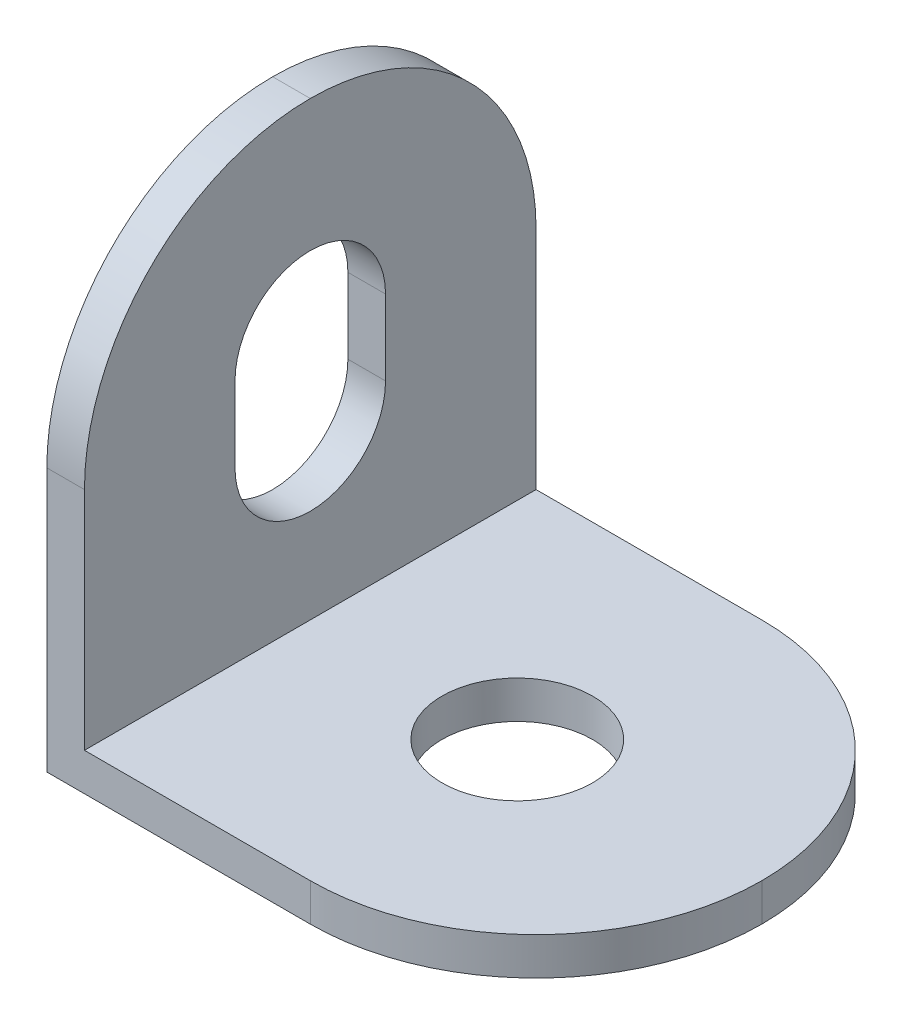
ISO-10303-21;
HEADER;
FILE_DESCRIPTION(('STEP AP214'),'2;1');
FILE_NAME('part.step','',(''),(''),'','','');
FILE_SCHEMA(('AUTOMOTIVE_DESIGN { 1 0 10303 214 1 1 1 1 }'));
ENDSEC;
DATA;
#1=APPLICATION_CONTEXT('core data for automotive mechanical design processes');
#2=APPLICATION_PROTOCOL_DEFINITION('international standard','automotive_design',2000,#1);
#3=PRODUCT_CONTEXT('',#1,'mechanical');
#4=PRODUCT('Part','Part','',(#3));
#5=PRODUCT_RELATED_PRODUCT_CATEGORY('part','',(#4));
#6=PRODUCT_DEFINITION_FORMATION('','',#4);
#7=PRODUCT_DEFINITION_CONTEXT('part definition',#1,'design');
#8=PRODUCT_DEFINITION('design','',#6,#7);
#9=PRODUCT_DEFINITION_SHAPE('','',#8);
#10=(LENGTH_UNIT() NAMED_UNIT(*) SI_UNIT(.MILLI.,.METRE.));
#11=(NAMED_UNIT(*) PLANE_ANGLE_UNIT() SI_UNIT($,.RADIAN.));
#12=(NAMED_UNIT(*) SI_UNIT($,.STERADIAN.) SOLID_ANGLE_UNIT());
#13=UNCERTAINTY_MEASURE_WITH_UNIT(LENGTH_MEASURE(1.E-05),#10,'distance_accuracy_value','');
#14=(GEOMETRIC_REPRESENTATION_CONTEXT(3) GLOBAL_UNCERTAINTY_ASSIGNED_CONTEXT((#13)) GLOBAL_UNIT_ASSIGNED_CONTEXT((#10,
#11,#12)) REPRESENTATION_CONTEXT('',''));
#15=CARTESIAN_POINT('',(0.,0.,0.));
#16=DIRECTION('',(0.,0.,1.));
#17=DIRECTION('',(1.,0.,0.));
#18=AXIS2_PLACEMENT_3D('',#15,#16,#17);
#19=CARTESIAN_POINT('',(0.,13.,12.));
#20=DIRECTION('',(1.,0.,0.));
#21=DIRECTION('',(0.,1.,0.));
#22=AXIS2_PLACEMENT_3D('',#19,#20,#21);
#23=PLANE('',#22);
#24=DIRECTION('',(0.,1.,0.));
#25=VECTOR('',#24,1.);
#26=CARTESIAN_POINT('',(0.,5.5,8.));
#27=LINE('',#26,#25);
#28=CARTESIAN_POINT('',(0.,5.5,8.));
#29=VERTEX_POINT('',#28);
#30=CARTESIAN_POINT('',(0.,7.5,8.));
#31=VERTEX_POINT('',#30);
#32=EDGE_CURVE('E137',#29,#31,#27,.T.);
#33=ORIENTED_EDGE('',*,*,#32,.F.);
#34=CARTESIAN_POINT('',(0.,5.5,6.));
#35=DIRECTION('',(-1.,0.,0.));
#36=DIRECTION('',(0.,-1.,0.));
#37=AXIS2_PLACEMENT_3D('',#34,#35,#36);
#38=CIRCLE('',#37,2.);
#39=CARTESIAN_POINT('',(0.,5.5,4.));
#40=VERTEX_POINT('',#39);
#41=EDGE_CURVE('E142',#40,#29,#38,.T.);
#42=ORIENTED_EDGE('',*,*,#41,.F.);
#43=DIRECTION('',(0.,-1.,0.));
#44=VECTOR('',#43,1.);
#45=CARTESIAN_POINT('',(0.,5.5,4.));
#46=LINE('',#45,#44);
#47=CARTESIAN_POINT('',(0.,7.5,4.));
#48=VERTEX_POINT('',#47);
#49=EDGE_CURVE('E146',#48,#40,#46,.T.);
#50=ORIENTED_EDGE('',*,*,#49,.F.);
#51=CARTESIAN_POINT('',(0.,7.5,6.));
#52=DIRECTION('',(-1.,0.,0.));
#53=DIRECTION('',(0.,-1.,0.));
#54=AXIS2_PLACEMENT_3D('',#51,#52,#53);
#55=CIRCLE('',#54,2.);
#56=EDGE_CURVE('E126',#31,#48,#55,.T.);
#57=ORIENTED_EDGE('',*,*,#56,.F.);
#58=EDGE_LOOP('',(#33,#42,#50,#57));
#59=FACE_BOUND('',#58,.T.);
#60=CARTESIAN_POINT('',(0.,7.,6.));
#61=DIRECTION('',(1.,0.,0.));
#62=DIRECTION('',(0.,1.,0.));
#63=AXIS2_PLACEMENT_3D('',#60,#61,#62);
#64=CIRCLE('',#63,6.);
#65=CARTESIAN_POINT('',(0.,7.,12.));
#66=VERTEX_POINT('',#65);
#67=CARTESIAN_POINT('',(0.,13.,6.));
#68=VERTEX_POINT('',#67);
#69=EDGE_CURVE('E188',#66,#68,#64,.F.);
#70=ORIENTED_EDGE('',*,*,#69,.T.);
#71=CARTESIAN_POINT('',(0.,7.,6.));
#72=DIRECTION('',(1.,0.,0.));
#73=DIRECTION('',(0.,1.,0.));
#74=AXIS2_PLACEMENT_3D('',#71,#72,#73);
#75=CIRCLE('',#74,6.);
#76=CARTESIAN_POINT('',(0.,7.,0.));
#77=VERTEX_POINT('',#76);
#78=EDGE_CURVE('E194',#68,#77,#75,.F.);
#79=ORIENTED_EDGE('',*,*,#78,.T.);
#80=DIRECTION('',(0.,-1.,0.));
#81=VECTOR('',#80,1.);
#82=CARTESIAN_POINT('',(0.,13.,0.));
#83=LINE('',#82,#81);
#84=CARTESIAN_POINT('',(0.,0.,0.));
#85=VERTEX_POINT('',#84);
#86=EDGE_CURVE('E153',#77,#85,#83,.T.);
#87=ORIENTED_EDGE('',*,*,#86,.T.);
#88=DIRECTION('',(0.,0.,-1.));
#89=VECTOR('',#88,1.);
#90=CARTESIAN_POINT('',(0.,0.,12.));
#91=LINE('',#90,#89);
#92=CARTESIAN_POINT('',(0.,0.,12.));
#93=VERTEX_POINT('',#92);
#94=EDGE_CURVE('E176',#93,#85,#91,.T.);
#95=ORIENTED_EDGE('',*,*,#94,.F.);
#96=DIRECTION('',(0.,-1.,0.));
#97=VECTOR('',#96,1.);
#98=CARTESIAN_POINT('',(0.,13.,12.));
#99=LINE('',#98,#97);
#100=EDGE_CURVE('E156',#66,#93,#99,.T.);
#101=ORIENTED_EDGE('',*,*,#100,.F.);
#102=EDGE_LOOP('',(#70,#79,#87,#95,#101));
#103=FACE_BOUND('',#102,.T.);
#104=ADVANCED_FACE('F32',(#59,#103),#23,.F.);
#105=CARTESIAN_POINT('',(0.,0.,12.));
#106=DIRECTION('',(0.,1.,0.));
#107=DIRECTION('',(0.,0.,1.));
#108=AXIS2_PLACEMENT_3D('',#105,#106,#107);
#109=PLANE('',#108);
#110=CARTESIAN_POINT('',(6.5,0.,6.));
#111=DIRECTION('',(0.,-1.,0.));
#112=DIRECTION('',(0.,0.,-1.));
#113=AXIS2_PLACEMENT_3D('',#110,#111,#112);
#114=CIRCLE('',#113,2.);
#115=CARTESIAN_POINT('',(6.5,0.,4.));
#116=VERTEX_POINT('',#115);
#117=EDGE_CURVE('E192',#116,#116,#114,.T.);
#118=ORIENTED_EDGE('',*,*,#117,.F.);
#119=EDGE_LOOP('',(#118));
#120=FACE_BOUND('',#119,.T.);
#121=DIRECTION('',(1.,0.,0.));
#122=VECTOR('',#121,1.);
#123=CARTESIAN_POINT('',(0.,0.,0.));
#124=LINE('',#123,#122);
#125=CARTESIAN_POINT('',(7.,0.,0.));
#126=VERTEX_POINT('',#125);
#127=EDGE_CURVE('E168',#85,#126,#124,.T.);
#128=ORIENTED_EDGE('',*,*,#127,.T.);
#129=CARTESIAN_POINT('',(7.,0.,6.));
#130=DIRECTION('',(0.,1.,0.));
#131=DIRECTION('',(0.,0.,1.));
#132=AXIS2_PLACEMENT_3D('',#129,#130,#131);
#133=CIRCLE('',#132,6.);
#134=CARTESIAN_POINT('',(13.,0.,6.));
#135=VERTEX_POINT('',#134);
#136=EDGE_CURVE('E54',#126,#135,#133,.F.);
#137=ORIENTED_EDGE('',*,*,#136,.T.);
#138=CARTESIAN_POINT('',(7.,0.,6.));
#139=DIRECTION('',(0.,1.,0.));
#140=DIRECTION('',(0.,0.,1.));
#141=AXIS2_PLACEMENT_3D('',#138,#139,#140);
#142=CIRCLE('',#141,6.);
#143=CARTESIAN_POINT('',(7.,0.,12.));
#144=VERTEX_POINT('',#143);
#145=EDGE_CURVE('E49',#135,#144,#142,.F.);
#146=ORIENTED_EDGE('',*,*,#145,.T.);
#147=DIRECTION('',(1.,0.,0.));
#148=VECTOR('',#147,1.);
#149=CARTESIAN_POINT('',(0.,0.,12.));
#150=LINE('',#149,#148);
#151=EDGE_CURVE('E158',#93,#144,#150,.T.);
#152=ORIENTED_EDGE('',*,*,#151,.F.);
#153=ORIENTED_EDGE('',*,*,#94,.T.);
#154=EDGE_LOOP('',(#128,#137,#146,#152,#153));
#155=FACE_BOUND('',#154,.T.);
#156=ADVANCED_FACE('F247',(#120,#155),#109,.F.);
#157=CARTESIAN_POINT('',(13.,0.999999999999997,12.));
#158=DIRECTION('',(0.,-1.,0.));
#159=DIRECTION('',(1.,0.,0.));
#160=AXIS2_PLACEMENT_3D('',#157,#158,#159);
#161=PLANE('',#160);
#162=CARTESIAN_POINT('',(6.5,0.999999999999997,6.));
#163=DIRECTION('',(0.,-1.,0.));
#164=DIRECTION('',(1.,0.,0.));
#165=AXIS2_PLACEMENT_3D('',#162,#163,#164);
#166=CIRCLE('',#165,2.);
#167=CARTESIAN_POINT('',(8.5,0.999999999999998,6.));
#168=VERTEX_POINT('',#167);
#169=EDGE_CURVE('E189',#168,#168,#166,.T.);
#170=ORIENTED_EDGE('',*,*,#169,.T.);
#171=EDGE_LOOP('',(#170));
#172=FACE_BOUND('',#171,.T.);
#173=CARTESIAN_POINT('',(7.,0.999999999999996,6.));
#174=DIRECTION('',(0.,-1.,0.));
#175=DIRECTION('',(1.,0.,0.));
#176=AXIS2_PLACEMENT_3D('',#173,#174,#175);
#177=CIRCLE('',#176,6.);
#178=CARTESIAN_POINT('',(7.,0.999999999999996,12.));
#179=VERTEX_POINT('',#178);
#180=CARTESIAN_POINT('',(13.,0.999999999999997,6.));
#181=VERTEX_POINT('',#180);
#182=EDGE_CURVE('E206',#179,#181,#177,.F.);
#183=ORIENTED_EDGE('',*,*,#182,.T.);
#184=CARTESIAN_POINT('',(7.,0.999999999999996,6.));
#185=DIRECTION('',(0.,-1.,0.));
#186=DIRECTION('',(1.,0.,0.));
#187=AXIS2_PLACEMENT_3D('',#184,#185,#186);
#188=CIRCLE('',#187,6.);
#189=CARTESIAN_POINT('',(7.,0.999999999999996,0.));
#190=VERTEX_POINT('',#189);
#191=EDGE_CURVE('E208',#181,#190,#188,.F.);
#192=ORIENTED_EDGE('',*,*,#191,.T.);
#193=DIRECTION('',(-1.,0.,0.));
#194=VECTOR('',#193,1.);
#195=CARTESIAN_POINT('',(13.,0.999999999999997,0.));
#196=LINE('',#195,#194);
#197=CARTESIAN_POINT('',(1.00000000000001,0.999999999999996,0.));
#198=VERTEX_POINT('',#197);
#199=EDGE_CURVE('E170',#190,#198,#196,.T.);
#200=ORIENTED_EDGE('',*,*,#199,.T.);
#201=DIRECTION('',(0.,0.,-1.));
#202=VECTOR('',#201,1.);
#203=CARTESIAN_POINT('',(1.00000000000001,0.999999999999996,12.));
#204=LINE('',#203,#202);
#205=CARTESIAN_POINT('',(1.00000000000001,0.999999999999996,12.));
#206=VERTEX_POINT('',#205);
#207=EDGE_CURVE('E166',#206,#198,#204,.T.);
#208=ORIENTED_EDGE('',*,*,#207,.F.);
#209=DIRECTION('',(-1.,0.,0.));
#210=VECTOR('',#209,1.);
#211=CARTESIAN_POINT('',(13.,0.999999999999997,12.));
#212=LINE('',#211,#210);
#213=EDGE_CURVE('E161',#179,#206,#212,.T.);
#214=ORIENTED_EDGE('',*,*,#213,.F.);
#215=EDGE_LOOP('',(#183,#192,#200,#208,#214));
#216=FACE_BOUND('',#215,.T.);
#217=ADVANCED_FACE('F233',(#172,#216),#161,.F.);
#218=CARTESIAN_POINT('',(1.00000000000001,0.999999999999996,12.));
#219=DIRECTION('',(-1.,0.,0.));
#220=DIRECTION('',(0.,-1.,0.));
#221=AXIS2_PLACEMENT_3D('',#218,#219,#220);
#222=PLANE('',#221);
#223=DIRECTION('',(0.,-1.,0.));
#224=VECTOR('',#223,1.);
#225=CARTESIAN_POINT('',(1.00000000000001,0.999999999999996,4.));
#226=LINE('',#225,#224);
#227=CARTESIAN_POINT('',(1.00000000000001,7.5,4.));
#228=VERTEX_POINT('',#227);
#229=CARTESIAN_POINT('',(1.00000000000001,5.5,4.));
#230=VERTEX_POINT('',#229);
#231=EDGE_CURVE('E182',#228,#230,#226,.T.);
#232=ORIENTED_EDGE('',*,*,#231,.T.);
#233=CARTESIAN_POINT('',(1.00000000000001,5.5,6.));
#234=DIRECTION('',(-1.,0.,0.));
#235=DIRECTION('',(0.,-1.,0.));
#236=AXIS2_PLACEMENT_3D('',#233,#234,#235);
#237=CIRCLE('',#236,2.);
#238=CARTESIAN_POINT('',(1.00000000000001,5.5,8.));
#239=VERTEX_POINT('',#238);
#240=EDGE_CURVE('E185',#230,#239,#237,.T.);
#241=ORIENTED_EDGE('',*,*,#240,.T.);
#242=DIRECTION('',(0.,1.,0.));
#243=VECTOR('',#242,1.);
#244=CARTESIAN_POINT('',(1.00000000000001,0.999999999999996,8.));
#245=LINE('',#244,#243);
#246=CARTESIAN_POINT('',(1.00000000000001,7.5,8.));
#247=VERTEX_POINT('',#246);
#248=EDGE_CURVE('E179',#239,#247,#245,.T.);
#249=ORIENTED_EDGE('',*,*,#248,.T.);
#250=CARTESIAN_POINT('',(1.00000000000001,7.5,6.));
#251=DIRECTION('',(-1.,0.,0.));
#252=DIRECTION('',(0.,-1.,0.));
#253=AXIS2_PLACEMENT_3D('',#250,#251,#252);
#254=CIRCLE('',#253,2.);
#255=EDGE_CURVE('E129',#247,#228,#254,.T.);
#256=ORIENTED_EDGE('',*,*,#255,.T.);
#257=EDGE_LOOP('',(#232,#241,#249,#256));
#258=FACE_BOUND('',#257,.T.);
#259=DIRECTION('',(0.,1.,0.));
#260=VECTOR('',#259,1.);
#261=CARTESIAN_POINT('',(1.00000000000001,0.999999999999996,0.));
#262=LINE('',#261,#260);
#263=CARTESIAN_POINT('',(1.00000000000001,7.,0.));
#264=VERTEX_POINT('',#263);
#265=EDGE_CURVE('E159',#198,#264,#262,.T.);
#266=ORIENTED_EDGE('',*,*,#265,.T.);
#267=CARTESIAN_POINT('',(1.00000000000001,7.,6.));
#268=DIRECTION('',(-1.,0.,0.));
#269=DIRECTION('',(0.,-1.,0.));
#270=AXIS2_PLACEMENT_3D('',#267,#268,#269);
#271=CIRCLE('',#270,6.);
#272=CARTESIAN_POINT('',(1.00000000000001,13.,6.));
#273=VERTEX_POINT('',#272);
#274=EDGE_CURVE('E204',#264,#273,#271,.F.);
#275=ORIENTED_EDGE('',*,*,#274,.T.);
#276=CARTESIAN_POINT('',(1.00000000000001,7.,6.));
#277=DIRECTION('',(-1.,0.,0.));
#278=DIRECTION('',(0.,-1.,0.));
#279=AXIS2_PLACEMENT_3D('',#276,#277,#278);
#280=CIRCLE('',#279,6.);
#281=CARTESIAN_POINT('',(1.00000000000001,7.,12.));
#282=VERTEX_POINT('',#281);
#283=EDGE_CURVE('E202',#273,#282,#280,.F.);
#284=ORIENTED_EDGE('',*,*,#283,.T.);
#285=DIRECTION('',(0.,1.,0.));
#286=VECTOR('',#285,1.);
#287=CARTESIAN_POINT('',(1.00000000000001,0.999999999999996,12.));
#288=LINE('',#287,#286);
#289=EDGE_CURVE('E163',#206,#282,#288,.T.);
#290=ORIENTED_EDGE('',*,*,#289,.F.);
#291=ORIENTED_EDGE('',*,*,#207,.T.);
#292=EDGE_LOOP('',(#266,#275,#284,#290,#291));
#293=FACE_BOUND('',#292,.T.);
#294=ADVANCED_FACE('F238',(#258,#293),#222,.F.);
#295=CARTESIAN_POINT('',(0.,0.,12.));
#296=DIRECTION('',(0.,0.,1.));
#297=DIRECTION('',(1.,0.,0.));
#298=AXIS2_PLACEMENT_3D('',#295,#296,#297);
#299=PLANE('',#298);
#300=ORIENTED_EDGE('',*,*,#151,.T.);
#301=DIRECTION('',(0.,1.,0.));
#302=VECTOR('',#301,1.);
#303=CARTESIAN_POINT('',(7.,0.999999999999997,12.));
#304=LINE('',#303,#302);
#305=EDGE_CURVE('E11',#144,#179,#304,.T.);
#306=ORIENTED_EDGE('',*,*,#305,.T.);
#307=ORIENTED_EDGE('',*,*,#213,.T.);
#308=ORIENTED_EDGE('',*,*,#289,.T.);
#309=DIRECTION('',(-1.,0.,0.));
#310=VECTOR('',#309,1.);
#311=CARTESIAN_POINT('',(0.,7.,12.));
#312=LINE('',#311,#310);
#313=EDGE_CURVE('E41',#282,#66,#312,.T.);
#314=ORIENTED_EDGE('',*,*,#313,.T.);
#315=ORIENTED_EDGE('',*,*,#100,.T.);
#316=EDGE_LOOP('',(#300,#306,#307,#308,#314,#315));
#317=FACE_BOUND('',#316,.T.);
#318=ADVANCED_FACE('F230',(#317),#299,.T.);
#319=CARTESIAN_POINT('',(0.,0.,0.));
#320=DIRECTION('',(0.,0.,1.));
#321=DIRECTION('',(1.,0.,0.));
#322=AXIS2_PLACEMENT_3D('',#319,#320,#321);
#323=PLANE('',#322);
#324=ORIENTED_EDGE('',*,*,#86,.F.);
#325=DIRECTION('',(-1.,0.,0.));
#326=VECTOR('',#325,1.);
#327=CARTESIAN_POINT('',(0.,7.,0.));
#328=LINE('',#327,#326);
#329=EDGE_CURVE('E199',#77,#264,#328,.F.);
#330=ORIENTED_EDGE('',*,*,#329,.T.);
#331=ORIENTED_EDGE('',*,*,#265,.F.);
#332=ORIENTED_EDGE('',*,*,#199,.F.);
#333=DIRECTION('',(0.,1.,0.));
#334=VECTOR('',#333,1.);
#335=CARTESIAN_POINT('',(7.,0.,0.));
#336=LINE('',#335,#334);
#337=EDGE_CURVE('E196',#190,#126,#336,.F.);
#338=ORIENTED_EDGE('',*,*,#337,.T.);
#339=ORIENTED_EDGE('',*,*,#127,.F.);
#340=EDGE_LOOP('',(#324,#330,#331,#332,#338,#339));
#341=FACE_BOUND('',#340,.T.);
#342=ADVANCED_FACE('F250',(#341),#323,.F.);
#343=CARTESIAN_POINT('',(13.,5.5,6.));
#344=DIRECTION('',(-1.,0.,0.));
#345=DIRECTION('',(0.,-1.,0.));
#346=AXIS2_PLACEMENT_3D('',#343,#344,#345);
#347=CYLINDRICAL_SURFACE('',#346,2.);
#348=DIRECTION('',(-1.,0.,0.));
#349=VECTOR('',#348,1.);
#350=CARTESIAN_POINT('',(13.,5.5,4.));
#351=LINE('',#350,#349);
#352=EDGE_CURVE('E151',#230,#40,#351,.T.);
#353=ORIENTED_EDGE('',*,*,#352,.T.);
#354=ORIENTED_EDGE('',*,*,#41,.T.);
#355=DIRECTION('',(-1.,0.,0.));
#356=VECTOR('',#355,1.);
#357=CARTESIAN_POINT('',(13.,5.5,8.));
#358=LINE('',#357,#356);
#359=EDGE_CURVE('E133',#239,#29,#358,.T.);
#360=ORIENTED_EDGE('',*,*,#359,.F.);
#361=ORIENTED_EDGE('',*,*,#240,.F.);
#362=EDGE_LOOP('',(#353,#354,#360,#361));
#363=FACE_BOUND('',#362,.T.);
#364=ADVANCED_FACE('F277',(#363),#347,.F.);
#365=CARTESIAN_POINT('',(13.,5.5,4.));
#366=DIRECTION('',(0.,0.,-1.));
#367=DIRECTION('',(-1.,0.,0.));
#368=AXIS2_PLACEMENT_3D('',#365,#366,#367);
#369=PLANE('',#368);
#370=DIRECTION('',(-1.,0.,0.));
#371=VECTOR('',#370,1.);
#372=CARTESIAN_POINT('',(13.,7.5,4.));
#373=LINE('',#372,#371);
#374=EDGE_CURVE('E132',#228,#48,#373,.T.);
#375=ORIENTED_EDGE('',*,*,#374,.T.);
#376=ORIENTED_EDGE('',*,*,#49,.T.);
#377=ORIENTED_EDGE('',*,*,#352,.F.);
#378=ORIENTED_EDGE('',*,*,#231,.F.);
#379=EDGE_LOOP('',(#375,#376,#377,#378));
#380=FACE_BOUND('',#379,.T.);
#381=ADVANCED_FACE('F282',(#380),#369,.F.);
#382=CARTESIAN_POINT('',(13.,7.5,6.));
#383=DIRECTION('',(-1.,0.,0.));
#384=DIRECTION('',(0.,-1.,0.));
#385=AXIS2_PLACEMENT_3D('',#382,#383,#384);
#386=CYLINDRICAL_SURFACE('',#385,2.);
#387=DIRECTION('',(-1.,0.,0.));
#388=VECTOR('',#387,1.);
#389=CARTESIAN_POINT('',(13.,7.5,8.));
#390=LINE('',#389,#388);
#391=EDGE_CURVE('E121',#247,#31,#390,.T.);
#392=ORIENTED_EDGE('',*,*,#391,.T.);
#393=ORIENTED_EDGE('',*,*,#56,.T.);
#394=ORIENTED_EDGE('',*,*,#374,.F.);
#395=ORIENTED_EDGE('',*,*,#255,.F.);
#396=EDGE_LOOP('',(#392,#393,#394,#395));
#397=FACE_BOUND('',#396,.T.);
#398=ADVANCED_FACE('F123',(#397),#386,.F.);
#399=CARTESIAN_POINT('',(13.,5.5,8.));
#400=DIRECTION('',(0.,0.,1.));
#401=DIRECTION('',(1.,0.,0.));
#402=AXIS2_PLACEMENT_3D('',#399,#400,#401);
#403=PLANE('',#402);
#404=ORIENTED_EDGE('',*,*,#359,.T.);
#405=ORIENTED_EDGE('',*,*,#32,.T.);
#406=ORIENTED_EDGE('',*,*,#391,.F.);
#407=ORIENTED_EDGE('',*,*,#248,.F.);
#408=EDGE_LOOP('',(#404,#405,#406,#407));
#409=FACE_BOUND('',#408,.T.);
#410=ADVANCED_FACE('F138',(#409),#403,.F.);
#411=CARTESIAN_POINT('',(6.5,13.,6.));
#412=DIRECTION('',(0.,-1.,0.));
#413=DIRECTION('',(0.,0.,-1.));
#414=AXIS2_PLACEMENT_3D('',#411,#412,#413);
#415=CYLINDRICAL_SURFACE('',#414,2.);
#416=ORIENTED_EDGE('',*,*,#117,.T.);
#417=EDGE_LOOP('',(#416));
#418=FACE_BOUND('',#417,.T.);
#419=ORIENTED_EDGE('',*,*,#169,.F.);
#420=EDGE_LOOP('',(#419));
#421=FACE_BOUND('',#420,.T.);
#422=ADVANCED_FACE('F259',(#418,#421),#415,.F.);
#423=CARTESIAN_POINT('',(0.,7.,6.));
#424=DIRECTION('',(1.,0.,0.));
#425=DIRECTION('',(0.,0.,-1.));
#426=AXIS2_PLACEMENT_3D('',#423,#424,#425);
#427=CYLINDRICAL_SURFACE('',#426,6.);
#428=ORIENTED_EDGE('',*,*,#313,.F.);
#429=ORIENTED_EDGE('',*,*,#283,.F.);
#430=DIRECTION('',(-1.,0.,0.));
#431=VECTOR('',#430,1.);
#432=CARTESIAN_POINT('',(1.00000000000001,13.,6.));
#433=LINE('',#432,#431);
#434=EDGE_CURVE('E212',#68,#273,#433,.F.);
#435=ORIENTED_EDGE('',*,*,#434,.F.);
#436=ORIENTED_EDGE('',*,*,#69,.F.);
#437=EDGE_LOOP('',(#428,#429,#435,#436));
#438=FACE_BOUND('',#437,.T.);
#439=ADVANCED_FACE('F244',(#438),#427,.T.);
#440=CARTESIAN_POINT('',(1.00000000000001,7.,6.));
#441=DIRECTION('',(-1.,0.,0.));
#442=DIRECTION('',(0.,0.,1.));
#443=AXIS2_PLACEMENT_3D('',#440,#441,#442);
#444=CYLINDRICAL_SURFACE('',#443,6.);
#445=ORIENTED_EDGE('',*,*,#274,.F.);
#446=ORIENTED_EDGE('',*,*,#329,.F.);
#447=ORIENTED_EDGE('',*,*,#78,.F.);
#448=ORIENTED_EDGE('',*,*,#434,.T.);
#449=EDGE_LOOP('',(#445,#446,#447,#448));
#450=FACE_BOUND('',#449,.T.);
#451=ADVANCED_FACE('F252',(#450),#444,.T.);
#452=CARTESIAN_POINT('',(7.,0.,6.));
#453=DIRECTION('',(0.,-1.,0.));
#454=DIRECTION('',(0.,0.,-1.));
#455=AXIS2_PLACEMENT_3D('',#452,#453,#454);
#456=CYLINDRICAL_SURFACE('',#455,6.);
#457=ORIENTED_EDGE('',*,*,#305,.F.);
#458=ORIENTED_EDGE('',*,*,#145,.F.);
#459=DIRECTION('',(0.,1.,0.));
#460=VECTOR('',#459,1.);
#461=CARTESIAN_POINT('',(13.,0.,6.));
#462=LINE('',#461,#460);
#463=EDGE_CURVE('E36',#181,#135,#462,.F.);
#464=ORIENTED_EDGE('',*,*,#463,.F.);
#465=ORIENTED_EDGE('',*,*,#182,.F.);
#466=EDGE_LOOP('',(#457,#458,#464,#465));
#467=FACE_BOUND('',#466,.T.);
#468=ADVANCED_FACE('F34',(#467),#456,.T.);
#469=CARTESIAN_POINT('',(7.,0.,6.));
#470=DIRECTION('',(0.,1.,0.));
#471=DIRECTION('',(0.,0.,1.));
#472=AXIS2_PLACEMENT_3D('',#469,#470,#471);
#473=CYLINDRICAL_SURFACE('',#472,6.);
#474=ORIENTED_EDGE('',*,*,#136,.F.);
#475=ORIENTED_EDGE('',*,*,#337,.F.);
#476=ORIENTED_EDGE('',*,*,#191,.F.);
#477=ORIENTED_EDGE('',*,*,#463,.T.);
#478=EDGE_LOOP('',(#474,#475,#476,#477));
#479=FACE_BOUND('',#478,.T.);
#480=ADVANCED_FACE('F223',(#479),#473,.T.);
#481=CLOSED_SHELL('',(#104,#156,#217,#294,#318,#342,#364,#381,#398,#410,#422,#439,#451,#468,#480));
#482=MANIFOLD_SOLID_BREP('B2',#481);
#483=ADVANCED_BREP_SHAPE_REPRESENTATION('',(#18,#482),#14);
#484=SHAPE_DEFINITION_REPRESENTATION(#9,#483);
ENDSEC;
END-ISO-10303-21;
